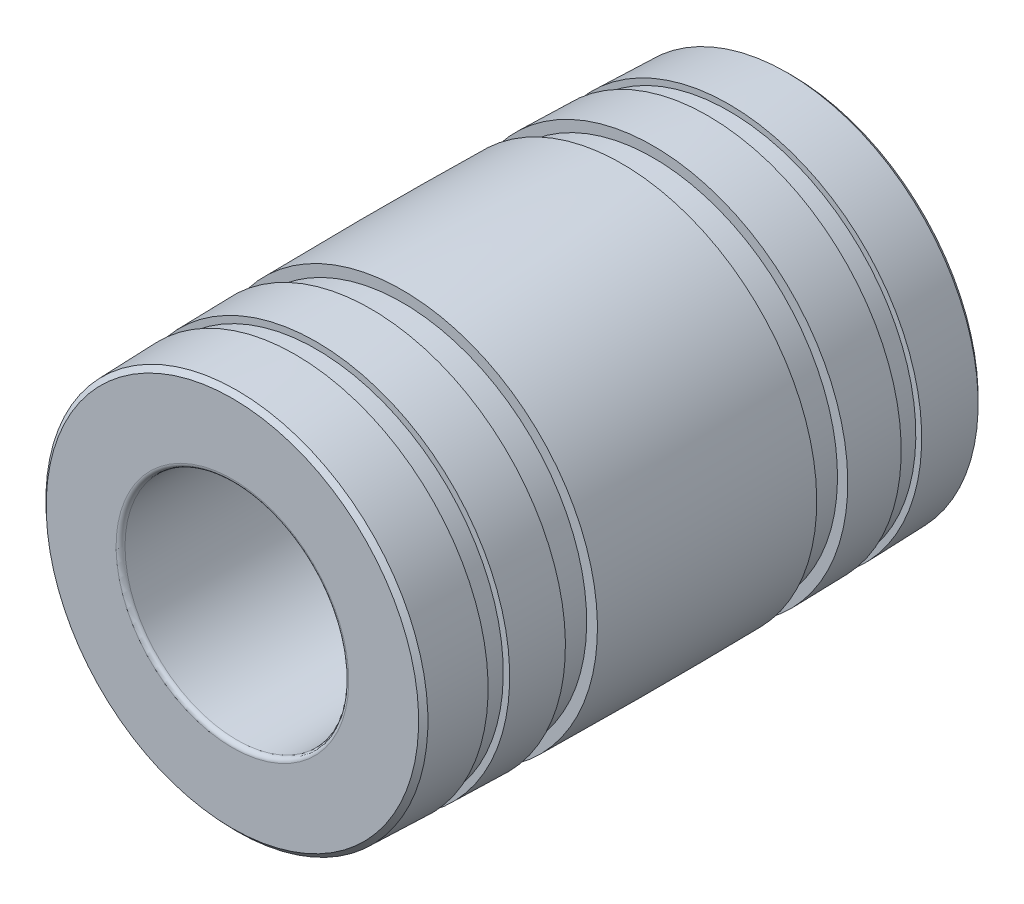
ISO-10303-21;
HEADER;
FILE_DESCRIPTION(('STEP AP214'),'2;1');
FILE_NAME('part.step','',(''),(''),'','','');
FILE_SCHEMA(('AUTOMOTIVE_DESIGN { 1 0 10303 214 1 1 1 1 }'));
ENDSEC;
DATA;
#1=APPLICATION_CONTEXT('core data for automotive mechanical design processes');
#2=APPLICATION_PROTOCOL_DEFINITION('international standard','automotive_design',2000,#1);
#3=PRODUCT_CONTEXT('',#1,'mechanical');
#4=PRODUCT('Part','Part','',(#3));
#5=PRODUCT_RELATED_PRODUCT_CATEGORY('part','',(#4));
#6=PRODUCT_DEFINITION_FORMATION('','',#4);
#7=PRODUCT_DEFINITION_CONTEXT('part definition',#1,'design');
#8=PRODUCT_DEFINITION('design','',#6,#7);
#9=PRODUCT_DEFINITION_SHAPE('','',#8);
#10=(LENGTH_UNIT() NAMED_UNIT(*) SI_UNIT(.MILLI.,.METRE.));
#11=(NAMED_UNIT(*) PLANE_ANGLE_UNIT() SI_UNIT($,.RADIAN.));
#12=(NAMED_UNIT(*) SI_UNIT($,.STERADIAN.) SOLID_ANGLE_UNIT());
#13=UNCERTAINTY_MEASURE_WITH_UNIT(LENGTH_MEASURE(1.E-05),#10,'distance_accuracy_value','');
#14=(GEOMETRIC_REPRESENTATION_CONTEXT(3) GLOBAL_UNCERTAINTY_ASSIGNED_CONTEXT((#13)) GLOBAL_UNIT_ASSIGNED_CONTEXT((#10,
#11,#12)) REPRESENTATION_CONTEXT('',''));
#15=CARTESIAN_POINT('',(0.,0.,0.));
#16=DIRECTION('',(0.,0.,1.));
#17=DIRECTION('',(1.,0.,0.));
#18=AXIS2_PLACEMENT_3D('',#15,#16,#17);
#19=CARTESIAN_POINT('',(0.,0.,15.8749999999999));
#20=DIRECTION('',(0.,0.,1.));
#21=DIRECTION('',(0.,-1.,0.));
#22=AXIS2_PLACEMENT_3D('',#19,#20,#21);
#23=PLANE('',#22);
#24=CARTESIAN_POINT('',(0.,0.,15.8749999999999));
#25=DIRECTION('',(0.,0.,1.));
#26=DIRECTION('',(0.,-1.,0.));
#27=AXIS2_PLACEMENT_3D('',#24,#25,#26);
#28=CIRCLE('',#27,6.604);
#29=CARTESIAN_POINT('',(0.,-6.604,15.8749999999999));
#30=VERTEX_POINT('',#29);
#31=EDGE_CURVE('E10',#30,#30,#28,.F.);
#32=ORIENTED_EDGE('',*,*,#31,.T.);
#33=EDGE_LOOP('',(#32));
#34=FACE_BOUND('',#33,.T.);
#35=CARTESIAN_POINT('',(0.,0.,15.8749999999999));
#36=DIRECTION('',(0.,0.,1.));
#37=DIRECTION('',(0.,-1.,0.));
#38=AXIS2_PLACEMENT_3D('',#35,#36,#37);
#39=CIRCLE('',#38,10.5713108714054);
#40=CARTESIAN_POINT('',(0.,-10.5713108714055,15.8749999999999));
#41=VERTEX_POINT('',#40);
#42=EDGE_CURVE('E55',#41,#41,#39,.T.);
#43=ORIENTED_EDGE('',*,*,#42,.T.);
#44=EDGE_LOOP('',(#43));
#45=FACE_BOUND('',#44,.T.);
#46=ADVANCED_FACE('F32',(#34,#45),#23,.T.);
#47=CARTESIAN_POINT('',(0.,0.,-15.875));
#48=DIRECTION('',(0.,0.,-1.));
#49=DIRECTION('',(0.,1.,0.));
#50=AXIS2_PLACEMENT_3D('',#47,#48,#49);
#51=PLANE('',#50);
#52=CARTESIAN_POINT('',(0.,0.,-15.875));
#53=DIRECTION('',(0.,0.,-1.));
#54=DIRECTION('',(0.,1.,0.));
#55=AXIS2_PLACEMENT_3D('',#52,#53,#54);
#56=CIRCLE('',#55,6.604);
#57=CARTESIAN_POINT('',(0.,6.604,-15.875));
#58=VERTEX_POINT('',#57);
#59=EDGE_CURVE('E47',#58,#58,#56,.F.);
#60=ORIENTED_EDGE('',*,*,#59,.T.);
#61=EDGE_LOOP('',(#60));
#62=FACE_BOUND('',#61,.T.);
#63=CARTESIAN_POINT('',(0.,0.,-15.875));
#64=DIRECTION('',(0.,0.,-1.));
#65=DIRECTION('',(0.,1.,0.));
#66=AXIS2_PLACEMENT_3D('',#63,#64,#65);
#67=CIRCLE('',#66,10.5806875000012);
#68=CARTESIAN_POINT('',(0.,10.5806875000013,-15.875));
#69=VERTEX_POINT('',#68);
#70=EDGE_CURVE('E58',#69,#69,#67,.T.);
#71=ORIENTED_EDGE('',*,*,#70,.T.);
#72=EDGE_LOOP('',(#71));
#73=FACE_BOUND('',#72,.T.);
#74=ADVANCED_FACE('F131',(#62,#73),#51,.T.);
#75=CARTESIAN_POINT('',(0.,0.,-3.23981570428529E-13));
#76=DIRECTION('',(0.,0.,1.));
#77=DIRECTION('',(0.,-1.,0.));
#78=AXIS2_PLACEMENT_3D('',#75,#76,#77);
#79=DEGENERATE_TOROIDAL_SURFACE('',#78,442.597834821435,453.710334821435,.F.);
#80=CARTESIAN_POINT('',(0.,0.,-15.6118638573303));
#81=DIRECTION('',(0.,0.,1.));
#82=DIRECTION('',(0.,-1.,0.));
#83=AXIS2_PLACEMENT_3D('',#80,#81,#82);
#84=CIRCLE('',#83,10.8438236426709);
#85=CARTESIAN_POINT('',(0.,-10.8438236426709,-15.6118638573303));
#86=VERTEX_POINT('',#85);
#87=EDGE_CURVE('E61',#86,#86,#84,.T.);
#88=ORIENTED_EDGE('',*,*,#87,.T.);
#89=EDGE_LOOP('',(#88));
#90=FACE_BOUND('',#89,.T.);
#91=CARTESIAN_POINT('',(0.,0.,-12.3062999999997));
#92=DIRECTION('',(0.,0.,1.));
#93=DIRECTION('',(0.,-1.,0.));
#94=AXIS2_PLACEMENT_3D('',#91,#92,#93);
#95=CIRCLE('',#94,10.9455731386948);
#96=CARTESIAN_POINT('',(0.,-10.9455731386948,-12.3062999999997));
#97=VERTEX_POINT('',#96);
#98=EDGE_CURVE('E64',#97,#97,#95,.T.);
#99=ORIENTED_EDGE('',*,*,#98,.F.);
#100=EDGE_LOOP('',(#99));
#101=FACE_BOUND('',#100,.T.);
#102=ADVANCED_FACE('F136',(#90,#101),#79,.F.);
#103=CARTESIAN_POINT('',(0.,10.9455731386948,-12.3062999999999));
#104=DIRECTION('',(0.,0.,1.));
#105=DIRECTION('',(0.,-1.,0.));
#106=AXIS2_PLACEMENT_3D('',#103,#104,#105);
#107=PLANE('',#106);
#108=ORIENTED_EDGE('',*,*,#98,.T.);
#109=EDGE_LOOP('',(#108));
#110=FACE_BOUND('',#109,.T.);
#111=CARTESIAN_POINT('',(0.,0.,-12.3063));
#112=DIRECTION('',(0.,0.,1.));
#113=DIRECTION('',(0.,-1.,0.));
#114=AXIS2_PLACEMENT_3D('',#111,#112,#113);
#115=CIRCLE('',#114,10.6121981386948);
#116=CARTESIAN_POINT('',(0.,-10.6121981386948,-12.3063));
#117=VERTEX_POINT('',#116);
#118=EDGE_CURVE('E67',#117,#117,#115,.T.);
#119=ORIENTED_EDGE('',*,*,#118,.F.);
#120=EDGE_LOOP('',(#119));
#121=FACE_BOUND('',#120,.T.);
#122=ADVANCED_FACE('F165',(#110,#121),#107,.T.);
#123=CARTESIAN_POINT('',(0.,0.,15.875));
#124=DIRECTION('',(0.,0.,1.));
#125=DIRECTION('',(0.,-1.,0.));
#126=AXIS2_PLACEMENT_3D('',#123,#124,#125);
#127=CYLINDRICAL_SURFACE('',#126,10.6121981386948);
#128=ORIENTED_EDGE('',*,*,#118,.T.);
#129=EDGE_LOOP('',(#128));
#130=FACE_BOUND('',#129,.T.);
#131=CARTESIAN_POINT('',(0.,0.,-11.1125));
#132=DIRECTION('',(0.,0.,1.));
#133=DIRECTION('',(0.,-1.,0.));
#134=AXIS2_PLACEMENT_3D('',#131,#132,#133);
#135=CIRCLE('',#134,10.6121981386948);
#136=CARTESIAN_POINT('',(0.,-10.6121981386948,-11.1125));
#137=VERTEX_POINT('',#136);
#138=EDGE_CURVE('E70',#137,#137,#135,.T.);
#139=ORIENTED_EDGE('',*,*,#138,.F.);
#140=EDGE_LOOP('',(#139));
#141=FACE_BOUND('',#140,.T.);
#142=ADVANCED_FACE('F170',(#130,#141),#127,.T.);
#143=CARTESIAN_POINT('',(0.,10.6121981386948,-11.1125));
#144=DIRECTION('',(0.,0.,-1.));
#145=DIRECTION('',(0.,1.,0.));
#146=AXIS2_PLACEMENT_3D('',#143,#144,#145);
#147=PLANE('',#146);
#148=ORIENTED_EDGE('',*,*,#138,.T.);
#149=EDGE_LOOP('',(#148));
#150=FACE_BOUND('',#149,.T.);
#151=CARTESIAN_POINT('',(0.,0.,-11.1125));
#152=DIRECTION('',(0.,0.,1.));
#153=DIRECTION('',(0.,-1.,0.));
#154=AXIS2_PLACEMENT_3D('',#151,#152,#153);
#155=CIRCLE('',#154,10.9763931363808);
#156=CARTESIAN_POINT('',(0.,-10.9763931363809,-11.1125));
#157=VERTEX_POINT('',#156);
#158=EDGE_CURVE('E73',#157,#157,#155,.T.);
#159=ORIENTED_EDGE('',*,*,#158,.F.);
#160=EDGE_LOOP('',(#159));
#161=FACE_BOUND('',#160,.T.);
#162=ADVANCED_FACE('F176',(#150,#161),#147,.T.);
#163=CARTESIAN_POINT('',(0.,0.,-3.23981570428529E-13));
#164=DIRECTION('',(0.,0.,1.));
#165=DIRECTION('',(0.,-1.,0.));
#166=AXIS2_PLACEMENT_3D('',#163,#164,#165);
#167=DEGENERATE_TOROIDAL_SURFACE('',#166,442.597834821435,453.710334821434,.F.);
#168=ORIENTED_EDGE('',*,*,#158,.T.);
#169=EDGE_LOOP('',(#168));
#170=FACE_BOUND('',#169,.T.);
#171=CARTESIAN_POINT('',(0.,0.,-8.01369999999997));
#172=DIRECTION('',(0.,0.,1.));
#173=DIRECTION('',(0.,-1.,0.));
#174=AXIS2_PLACEMENT_3D('',#171,#172,#173);
#175=CIRCLE('',#174,11.0417231274812);
#176=CARTESIAN_POINT('',(0.,-11.0417231274812,-8.01369999999998));
#177=VERTEX_POINT('',#176);
#178=EDGE_CURVE('E76',#177,#177,#175,.T.);
#179=ORIENTED_EDGE('',*,*,#178,.F.);
#180=EDGE_LOOP('',(#179));
#181=FACE_BOUND('',#180,.T.);
#182=ADVANCED_FACE('F182',(#170,#181),#167,.F.);
#183=CARTESIAN_POINT('',(0.,10.4583168774805,-8.01369999999997));
#184=DIRECTION('',(0.,0.,1.));
#185=DIRECTION('',(0.,-1.,0.));
#186=AXIS2_PLACEMENT_3D('',#183,#184,#185);
#187=PLANE('',#186);
#188=ORIENTED_EDGE('',*,*,#178,.T.);
#189=EDGE_LOOP('',(#188));
#190=FACE_BOUND('',#189,.T.);
#191=CARTESIAN_POINT('',(0.,0.,-8.01369999999999));
#192=DIRECTION('',(0.,0.,1.));
#193=DIRECTION('',(0.,-1.,0.));
#194=AXIS2_PLACEMENT_3D('',#191,#192,#193);
#195=CIRCLE('',#194,10.4583168774805);
#196=CARTESIAN_POINT('',(0.,-10.4583168774805,-8.01369999999999));
#197=VERTEX_POINT('',#196);
#198=EDGE_CURVE('E79',#197,#197,#195,.T.);
#199=ORIENTED_EDGE('',*,*,#198,.F.);
#200=EDGE_LOOP('',(#199));
#201=FACE_BOUND('',#200,.T.);
#202=ADVANCED_FACE('F188',(#190,#201),#187,.T.);
#203=CARTESIAN_POINT('',(0.,0.,15.875));
#204=DIRECTION('',(0.,0.,1.));
#205=DIRECTION('',(0.,-1.,0.));
#206=AXIS2_PLACEMENT_3D('',#203,#204,#205);
#207=CYLINDRICAL_SURFACE('',#206,10.4583168774805);
#208=ORIENTED_EDGE('',*,*,#198,.T.);
#209=EDGE_LOOP('',(#208));
#210=FACE_BOUND('',#209,.T.);
#211=CARTESIAN_POINT('',(0.,0.,-6.22299999999999));
#212=DIRECTION('',(0.,0.,1.));
#213=DIRECTION('',(0.,-1.,0.));
#214=AXIS2_PLACEMENT_3D('',#211,#212,#213);
#215=CIRCLE('',#214,10.4583168774805);
#216=CARTESIAN_POINT('',(0.,-10.4583168774805,-6.223));
#217=VERTEX_POINT('',#216);
#218=EDGE_CURVE('E82',#217,#217,#215,.T.);
#219=ORIENTED_EDGE('',*,*,#218,.F.);
#220=EDGE_LOOP('',(#219));
#221=FACE_BOUND('',#220,.T.);
#222=ADVANCED_FACE('F194',(#210,#221),#207,.T.);
#223=CARTESIAN_POINT('',(0.,11.0698212824343,-6.22299999999998));
#224=DIRECTION('',(0.,0.,-1.));
#225=DIRECTION('',(0.,1.,0.));
#226=AXIS2_PLACEMENT_3D('',#223,#224,#225);
#227=PLANE('',#226);
#228=ORIENTED_EDGE('',*,*,#218,.T.);
#229=EDGE_LOOP('',(#228));
#230=FACE_BOUND('',#229,.T.);
#231=CARTESIAN_POINT('',(0.,0.,-6.22299999999999));
#232=DIRECTION('',(0.,0.,1.));
#233=DIRECTION('',(0.,-1.,0.));
#234=AXIS2_PLACEMENT_3D('',#231,#232,#233);
#235=CIRCLE('',#234,11.0698212824344);
#236=CARTESIAN_POINT('',(0.,-11.0698212824344,-6.223));
#237=VERTEX_POINT('',#236);
#238=EDGE_CURVE('E85',#237,#237,#235,.T.);
#239=ORIENTED_EDGE('',*,*,#238,.F.);
#240=EDGE_LOOP('',(#239));
#241=FACE_BOUND('',#240,.T.);
#242=ADVANCED_FACE('F200',(#230,#241),#227,.T.);
#243=CARTESIAN_POINT('',(0.,0.,-3.23981570428529E-13));
#244=DIRECTION('',(0.,0.,1.));
#245=DIRECTION('',(0.,-1.,0.));
#246=AXIS2_PLACEMENT_3D('',#243,#244,#245);
#247=DEGENERATE_TOROIDAL_SURFACE('',#246,442.597834821435,453.710334821435,.F.);
#248=ORIENTED_EDGE('',*,*,#238,.T.);
#249=EDGE_LOOP('',(#248));
#250=FACE_BOUND('',#249,.T.);
#251=CARTESIAN_POINT('',(0.,0.,6.22299999999997));
#252=DIRECTION('',(0.,0.,1.));
#253=DIRECTION('',(0.,-1.,0.));
#254=AXIS2_PLACEMENT_3D('',#251,#252,#253);
#255=CIRCLE('',#254,11.0698212824343);
#256=CARTESIAN_POINT('',(0.,-11.0698212824343,6.22299999999997));
#257=VERTEX_POINT('',#256);
#258=EDGE_CURVE('E88',#257,#257,#255,.T.);
#259=ORIENTED_EDGE('',*,*,#258,.F.);
#260=EDGE_LOOP('',(#259));
#261=FACE_BOUND('',#260,.T.);
#262=ADVANCED_FACE('F206',(#250,#261),#247,.F.);
#263=CARTESIAN_POINT('',(0.,10.4583168774805,6.223));
#264=DIRECTION('',(0.,0.,1.));
#265=DIRECTION('',(0.,-1.,0.));
#266=AXIS2_PLACEMENT_3D('',#263,#264,#265);
#267=PLANE('',#266);
#268=ORIENTED_EDGE('',*,*,#258,.T.);
#269=EDGE_LOOP('',(#268));
#270=FACE_BOUND('',#269,.T.);
#271=CARTESIAN_POINT('',(0.,0.,6.22300000000001));
#272=DIRECTION('',(0.,0.,1.));
#273=DIRECTION('',(0.,-1.,0.));
#274=AXIS2_PLACEMENT_3D('',#271,#272,#273);
#275=CIRCLE('',#274,10.4583168774805);
#276=CARTESIAN_POINT('',(0.,-10.4583168774805,6.223));
#277=VERTEX_POINT('',#276);
#278=EDGE_CURVE('E91',#277,#277,#275,.T.);
#279=ORIENTED_EDGE('',*,*,#278,.F.);
#280=EDGE_LOOP('',(#279));
#281=FACE_BOUND('',#280,.T.);
#282=ADVANCED_FACE('F212',(#270,#281),#267,.T.);
#283=CARTESIAN_POINT('',(0.,0.,15.875));
#284=DIRECTION('',(0.,0.,1.));
#285=DIRECTION('',(0.,-1.,0.));
#286=AXIS2_PLACEMENT_3D('',#283,#284,#285);
#287=CYLINDRICAL_SURFACE('',#286,10.4583168774805);
#288=ORIENTED_EDGE('',*,*,#278,.T.);
#289=EDGE_LOOP('',(#288));
#290=FACE_BOUND('',#289,.T.);
#291=CARTESIAN_POINT('',(0.,0.,8.0137));
#292=DIRECTION('',(0.,0.,1.));
#293=DIRECTION('',(0.,-1.,0.));
#294=AXIS2_PLACEMENT_3D('',#291,#292,#293);
#295=CIRCLE('',#294,10.4583168774805);
#296=CARTESIAN_POINT('',(0.,-10.4583168774805,8.0137));
#297=VERTEX_POINT('',#296);
#298=EDGE_CURVE('E94',#297,#297,#295,.T.);
#299=ORIENTED_EDGE('',*,*,#298,.F.);
#300=EDGE_LOOP('',(#299));
#301=FACE_BOUND('',#300,.T.);
#302=ADVANCED_FACE('F218',(#290,#301),#287,.T.);
#303=CARTESIAN_POINT('',(0.,11.0417231274805,8.01370000000001));
#304=DIRECTION('',(0.,0.,-1.));
#305=DIRECTION('',(0.,1.,0.));
#306=AXIS2_PLACEMENT_3D('',#303,#304,#305);
#307=PLANE('',#306);
#308=ORIENTED_EDGE('',*,*,#298,.T.);
#309=EDGE_LOOP('',(#308));
#310=FACE_BOUND('',#309,.T.);
#311=CARTESIAN_POINT('',(0.,0.,8.0137));
#312=DIRECTION('',(0.,0.,1.));
#313=DIRECTION('',(0.,-1.,0.));
#314=AXIS2_PLACEMENT_3D('',#311,#312,#313);
#315=CIRCLE('',#314,11.0417231274805);
#316=CARTESIAN_POINT('',(0.,-11.0417231274805,8.01369999999999));
#317=VERTEX_POINT('',#316);
#318=EDGE_CURVE('E97',#317,#317,#315,.T.);
#319=ORIENTED_EDGE('',*,*,#318,.F.);
#320=EDGE_LOOP('',(#319));
#321=FACE_BOUND('',#320,.T.);
#322=ADVANCED_FACE('F224',(#310,#321),#307,.T.);
#323=CARTESIAN_POINT('',(0.,0.,-3.23981570428529E-13));
#324=DIRECTION('',(0.,0.,1.));
#325=DIRECTION('',(0.,-1.,0.));
#326=AXIS2_PLACEMENT_3D('',#323,#324,#325);
#327=DEGENERATE_TOROIDAL_SURFACE('',#326,442.597834821435,453.710334821434,.F.);
#328=ORIENTED_EDGE('',*,*,#318,.T.);
#329=EDGE_LOOP('',(#328));
#330=FACE_BOUND('',#329,.T.);
#331=CARTESIAN_POINT('',(0.,0.,11.1124999999999));
#332=DIRECTION('',(0.,0.,1.));
#333=DIRECTION('',(0.,-1.,0.));
#334=AXIS2_PLACEMENT_3D('',#331,#332,#333);
#335=CIRCLE('',#334,10.9763931363801);
#336=CARTESIAN_POINT('',(0.,-10.9763931363801,11.1124999999999));
#337=VERTEX_POINT('',#336);
#338=EDGE_CURVE('E100',#337,#337,#335,.T.);
#339=ORIENTED_EDGE('',*,*,#338,.F.);
#340=EDGE_LOOP('',(#339));
#341=FACE_BOUND('',#340,.T.);
#342=ADVANCED_FACE('F230',(#330,#341),#327,.F.);
#343=CARTESIAN_POINT('',(0.,10.6121981386947,11.1125));
#344=DIRECTION('',(0.,0.,1.));
#345=DIRECTION('',(0.,-1.,0.));
#346=AXIS2_PLACEMENT_3D('',#343,#344,#345);
#347=PLANE('',#346);
#348=ORIENTED_EDGE('',*,*,#338,.T.);
#349=EDGE_LOOP('',(#348));
#350=FACE_BOUND('',#349,.T.);
#351=CARTESIAN_POINT('',(0.,0.,11.1125));
#352=DIRECTION('',(0.,0.,1.));
#353=DIRECTION('',(0.,-1.,0.));
#354=AXIS2_PLACEMENT_3D('',#351,#352,#353);
#355=CIRCLE('',#354,10.6121981386948);
#356=CARTESIAN_POINT('',(0.,-10.6121981386948,11.1125));
#357=VERTEX_POINT('',#356);
#358=EDGE_CURVE('E103',#357,#357,#355,.T.);
#359=ORIENTED_EDGE('',*,*,#358,.F.);
#360=EDGE_LOOP('',(#359));
#361=FACE_BOUND('',#360,.T.);
#362=ADVANCED_FACE('F127',(#350,#361),#347,.T.);
#363=CARTESIAN_POINT('',(0.,0.,15.875));
#364=DIRECTION('',(0.,0.,1.));
#365=DIRECTION('',(0.,-1.,0.));
#366=AXIS2_PLACEMENT_3D('',#363,#364,#365);
#367=CYLINDRICAL_SURFACE('',#366,10.6121981386948);
#368=ORIENTED_EDGE('',*,*,#358,.T.);
#369=EDGE_LOOP('',(#368));
#370=FACE_BOUND('',#369,.T.);
#371=CARTESIAN_POINT('',(0.,0.,12.3063));
#372=DIRECTION('',(0.,0.,1.));
#373=DIRECTION('',(0.,-1.,0.));
#374=AXIS2_PLACEMENT_3D('',#371,#372,#373);
#375=CIRCLE('',#374,10.6121981386948);
#376=CARTESIAN_POINT('',(0.,-10.6121981386948,12.3063));
#377=VERTEX_POINT('',#376);
#378=EDGE_CURVE('E106',#377,#377,#375,.T.);
#379=ORIENTED_EDGE('',*,*,#378,.F.);
#380=EDGE_LOOP('',(#379));
#381=FACE_BOUND('',#380,.T.);
#382=ADVANCED_FACE('F117',(#370,#381),#367,.T.);
#383=CARTESIAN_POINT('',(0.,10.9455731386947,12.3063));
#384=DIRECTION('',(0.,0.,-1.));
#385=DIRECTION('',(0.,1.,0.));
#386=AXIS2_PLACEMENT_3D('',#383,#384,#385);
#387=PLANE('',#386);
#388=ORIENTED_EDGE('',*,*,#378,.T.);
#389=EDGE_LOOP('',(#388));
#390=FACE_BOUND('',#389,.T.);
#391=CARTESIAN_POINT('',(0.,0.,12.3063));
#392=DIRECTION('',(0.,0.,1.));
#393=DIRECTION('',(0.,-1.,0.));
#394=AXIS2_PLACEMENT_3D('',#391,#392,#393);
#395=CIRCLE('',#394,10.9455731386948);
#396=CARTESIAN_POINT('',(0.,-10.9455731386948,12.3063));
#397=VERTEX_POINT('',#396);
#398=EDGE_CURVE('E109',#397,#397,#395,.T.);
#399=ORIENTED_EDGE('',*,*,#398,.F.);
#400=EDGE_LOOP('',(#399));
#401=FACE_BOUND('',#400,.T.);
#402=ADVANCED_FACE('F115',(#390,#401),#387,.T.);
#403=CARTESIAN_POINT('',(0.,0.,-3.23981570428529E-13));
#404=DIRECTION('',(0.,0.,1.));
#405=DIRECTION('',(0.,-1.,0.));
#406=AXIS2_PLACEMENT_3D('',#403,#404,#405);
#407=DEGENERATE_TOROIDAL_SURFACE('',#406,442.597834821435,453.710334821435,.F.);
#408=CARTESIAN_POINT('',(0.,0.,15.6212240560306));
#409=DIRECTION('',(0.,0.,-1.));
#410=DIRECTION('',(0.,1.,0.));
#411=AXIS2_PLACEMENT_3D('',#408,#409,#410);
#412=CIRCLE('',#411,10.8435012770398);
#413=CARTESIAN_POINT('',(0.,10.8435012770398,15.6212240560306));
#414=VERTEX_POINT('',#413);
#415=EDGE_CURVE('E52',#414,#414,#412,.T.);
#416=ORIENTED_EDGE('',*,*,#415,.T.);
#417=EDGE_LOOP('',(#416));
#418=FACE_BOUND('',#417,.T.);
#419=ORIENTED_EDGE('',*,*,#398,.T.);
#420=EDGE_LOOP('',(#419));
#421=FACE_BOUND('',#420,.T.);
#422=ADVANCED_FACE('F113',(#418,#421),#407,.F.);
#423=CARTESIAN_POINT('',(0.,0.,-15.875));
#424=DIRECTION('',(0.,0.,1.));
#425=DIRECTION('',(1.,0.,0.));
#426=AXIS2_PLACEMENT_3D('',#423,#424,#425);
#427=CYLINDRICAL_SURFACE('',#426,6.35);
#428=CARTESIAN_POINT('',(0.,0.,-15.621));
#429=DIRECTION('',(0.,0.,-1.));
#430=DIRECTION('',(0.,1.,0.));
#431=AXIS2_PLACEMENT_3D('',#428,#429,#430);
#432=CIRCLE('',#431,6.35);
#433=CARTESIAN_POINT('',(0.,6.35,-15.621));
#434=VERTEX_POINT('',#433);
#435=EDGE_CURVE('E39',#434,#434,#432,.T.);
#436=ORIENTED_EDGE('',*,*,#435,.T.);
#437=EDGE_LOOP('',(#436));
#438=FACE_BOUND('',#437,.T.);
#439=CARTESIAN_POINT('',(0.,0.,15.6209999999999));
#440=DIRECTION('',(0.,0.,1.));
#441=DIRECTION('',(0.,-1.,0.));
#442=AXIS2_PLACEMENT_3D('',#439,#440,#441);
#443=CIRCLE('',#442,6.35);
#444=CARTESIAN_POINT('',(0.,-6.35,15.6209999999999));
#445=VERTEX_POINT('',#444);
#446=EDGE_CURVE('E43',#445,#445,#443,.T.);
#447=ORIENTED_EDGE('',*,*,#446,.T.);
#448=EDGE_LOOP('',(#447));
#449=FACE_BOUND('',#448,.T.);
#450=ADVANCED_FACE('F124',(#438,#449),#427,.F.);
#451=CARTESIAN_POINT('',(0.,0.,-15.6118638573303));
#452=DIRECTION('',(0.,0.,1.));
#453=DIRECTION('',(0.,-1.,0.));
#454=AXIS2_PLACEMENT_3D('',#451,#452,#453);
#455=CONICAL_SURFACE('',#454,10.8438236426709,0.785398163397438);
#456=ORIENTED_EDGE('',*,*,#70,.F.);
#457=EDGE_LOOP('',(#456));
#458=FACE_BOUND('',#457,.T.);
#459=ORIENTED_EDGE('',*,*,#87,.F.);
#460=EDGE_LOOP('',(#459));
#461=FACE_BOUND('',#460,.T.);
#462=ADVANCED_FACE('F142',(#458,#461),#455,.T.);
#463=CARTESIAN_POINT('',(0.,0.,15.8749999999999));
#464=DIRECTION('',(0.,0.,-1.));
#465=DIRECTION('',(0.,1.,0.));
#466=AXIS2_PLACEMENT_3D('',#463,#464,#465);
#467=CONICAL_SURFACE('',#466,10.5713108714054,0.820394591137087);
#468=ORIENTED_EDGE('',*,*,#415,.F.);
#469=EDGE_LOOP('',(#468));
#470=FACE_BOUND('',#469,.T.);
#471=ORIENTED_EDGE('',*,*,#42,.F.);
#472=EDGE_LOOP('',(#471));
#473=FACE_BOUND('',#472,.T.);
#474=ADVANCED_FACE('F145',(#470,#473),#467,.T.);
#475=CARTESIAN_POINT('',(0.,0.,-15.621));
#476=DIRECTION('',(0.,0.,-1.));
#477=DIRECTION('',(0.,1.,0.));
#478=AXIS2_PLACEMENT_3D('',#475,#476,#477);
#479=TOROIDAL_SURFACE('',#478,6.604,0.254);
#480=ORIENTED_EDGE('',*,*,#435,.F.);
#481=EDGE_LOOP('',(#480));
#482=FACE_BOUND('',#481,.T.);
#483=ORIENTED_EDGE('',*,*,#59,.F.);
#484=EDGE_LOOP('',(#483));
#485=FACE_BOUND('',#484,.T.);
#486=ADVANCED_FACE('F148',(#482,#485),#479,.T.);
#487=CARTESIAN_POINT('',(0.,0.,15.6209999999999));
#488=DIRECTION('',(0.,0.,1.));
#489=DIRECTION('',(0.,-1.,0.));
#490=AXIS2_PLACEMENT_3D('',#487,#488,#489);
#491=TOROIDAL_SURFACE('',#490,6.604,0.254);
#492=ORIENTED_EDGE('',*,*,#31,.F.);
#493=EDGE_LOOP('',(#492));
#494=FACE_BOUND('',#493,.T.);
#495=ORIENTED_EDGE('',*,*,#446,.F.);
#496=EDGE_LOOP('',(#495));
#497=FACE_BOUND('',#496,.T.);
#498=ADVANCED_FACE('F34',(#494,#497),#491,.T.);
#499=CLOSED_SHELL('',(#46,#74,#102,#122,#142,#162,#182,#202,#222,#242,#262,#282,#302,#322,#342,
#362,#382,#402,#422,#450,#462,#474,#486,#498));
#500=MANIFOLD_SOLID_BREP('B2',#499);
#501=ADVANCED_BREP_SHAPE_REPRESENTATION('',(#18,#500),#14);
#502=SHAPE_DEFINITION_REPRESENTATION(#9,#501);
ENDSEC;
END-ISO-10303-21;
